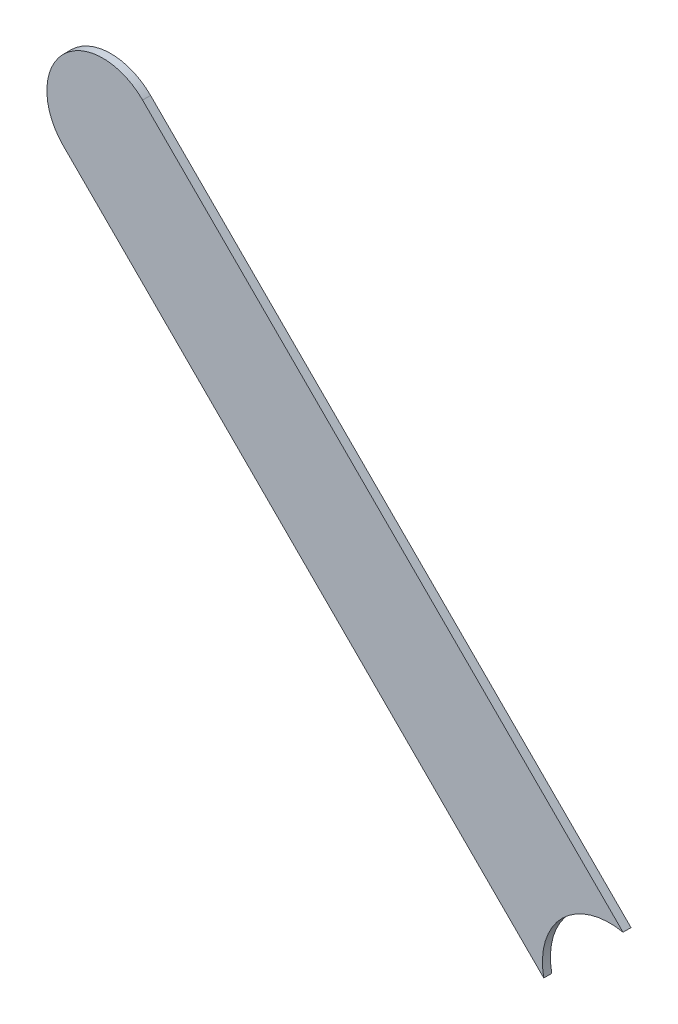
ISO-10303-21;
HEADER;
FILE_DESCRIPTION(('STEP AP214'),'2;1');
FILE_NAME('part.step','',(''),(''),'','','');
FILE_SCHEMA(('AUTOMOTIVE_DESIGN { 1 0 10303 214 1 1 1 1 }'));
ENDSEC;
DATA;
#1=APPLICATION_CONTEXT('core data for automotive mechanical design processes');
#2=APPLICATION_PROTOCOL_DEFINITION('international standard','automotive_design',2000,#1);
#3=PRODUCT_CONTEXT('',#1,'mechanical');
#4=PRODUCT('Part','Part','',(#3));
#5=PRODUCT_RELATED_PRODUCT_CATEGORY('part','',(#4));
#6=PRODUCT_DEFINITION_FORMATION('','',#4);
#7=PRODUCT_DEFINITION_CONTEXT('part definition',#1,'design');
#8=PRODUCT_DEFINITION('design','',#6,#7);
#9=PRODUCT_DEFINITION_SHAPE('','',#8);
#10=(LENGTH_UNIT() NAMED_UNIT(*) SI_UNIT(.MILLI.,.METRE.));
#11=(NAMED_UNIT(*) PLANE_ANGLE_UNIT() SI_UNIT($,.RADIAN.));
#12=(NAMED_UNIT(*) SI_UNIT($,.STERADIAN.) SOLID_ANGLE_UNIT());
#13=UNCERTAINTY_MEASURE_WITH_UNIT(LENGTH_MEASURE(1.E-05),#10,'distance_accuracy_value','');
#14=(GEOMETRIC_REPRESENTATION_CONTEXT(3) GLOBAL_UNCERTAINTY_ASSIGNED_CONTEXT((#13)) GLOBAL_UNIT_ASSIGNED_CONTEXT((#10,
#11,#12)) REPRESENTATION_CONTEXT('',''));
#15=CARTESIAN_POINT('',(0.,0.,0.));
#16=DIRECTION('',(0.,0.,1.));
#17=DIRECTION('',(1.,0.,0.));
#18=AXIS2_PLACEMENT_3D('',#15,#16,#17);
#19=CARTESIAN_POINT('',(116.76324882,115.38321602,0.));
#20=DIRECTION('',(0.70710678118655,0.707106781186545,0.));
#21=DIRECTION('',(0.707106781186545,-0.70710678118655,0.));
#22=AXIS2_PLACEMENT_3D('',#19,#20,#21);
#23=PLANE('',#22);
#24=DIRECTION('',(0.707106781186545,-0.70710678118655,0.));
#25=VECTOR('',#24,1.);
#26=CARTESIAN_POINT('',(116.76324882,115.38321602,0.03556));
#27=LINE('',#26,#25);
#28=CARTESIAN_POINT('',(116.76324882,115.38321602,0.03556));
#29=VERTEX_POINT('',#28);
#30=CARTESIAN_POINT('',(118.905979118199,113.240485721801,0.03556));
#31=VERTEX_POINT('',#30);
#32=EDGE_CURVE('E11',#29,#31,#27,.T.);
#33=ORIENTED_EDGE('',*,*,#32,.F.);
#34=DIRECTION('',(0.,0.,1.));
#35=VECTOR('',#34,1.);
#36=CARTESIAN_POINT('',(116.76324882,115.38321602,0.));
#37=LINE('',#36,#35);
#38=CARTESIAN_POINT('',(116.76324882,115.38321602,0.));
#39=VERTEX_POINT('',#38);
#40=EDGE_CURVE('E24',#39,#29,#37,.T.);
#41=ORIENTED_EDGE('',*,*,#40,.F.);
#42=DIRECTION('',(0.707106781186545,-0.70710678118655,0.));
#43=VECTOR('',#42,1.);
#44=CARTESIAN_POINT('',(116.76324882,115.38321602,0.));
#45=LINE('',#44,#43);
#46=CARTESIAN_POINT('',(118.905979118199,113.240485721801,0.));
#47=VERTEX_POINT('',#46);
#48=EDGE_CURVE('E75',#39,#47,#45,.T.);
#49=ORIENTED_EDGE('',*,*,#48,.T.);
#50=DIRECTION('',(0.,0.,1.));
#51=VECTOR('',#50,1.);
#52=CARTESIAN_POINT('',(118.905979118199,113.240485721801,0.));
#53=LINE('',#52,#51);
#54=EDGE_CURVE('E37',#47,#31,#53,.T.);
#55=ORIENTED_EDGE('',*,*,#54,.T.);
#56=EDGE_LOOP('',(#33,#41,#49,#55));
#57=FACE_BOUND('',#56,.T.);
#58=ADVANCED_FACE('F17',(#57),#23,.F.);
#59=CARTESIAN_POINT('',(119.2000156,113.300002,0.));
#60=DIRECTION('',(0.,0.,-1.));
#61=DIRECTION('',(1.,0.,0.));
#62=AXIS2_PLACEMENT_3D('',#59,#60,#61);
#63=CYLINDRICAL_SURFACE('',#62,0.2999994);
#64=DIRECTION('',(0.,0.,1.));
#65=VECTOR('',#64,1.);
#66=CARTESIAN_POINT('',(119.259531878199,113.594038481801,0.));
#67=LINE('',#66,#65);
#68=CARTESIAN_POINT('',(119.259531878199,113.594038481801,0.));
#69=VERTEX_POINT('',#68);
#70=CARTESIAN_POINT('',(119.259531878199,113.594038481801,0.03556));
#71=VERTEX_POINT('',#70);
#72=EDGE_CURVE('E67',#69,#71,#67,.T.);
#73=ORIENTED_EDGE('',*,*,#72,.T.);
#74=CARTESIAN_POINT('',(119.2000156,113.300002,0.03556));
#75=DIRECTION('',(0.,0.,1.));
#76=DIRECTION('',(1.,0.,0.));
#77=AXIS2_PLACEMENT_3D('',#74,#75,#76);
#78=CIRCLE('',#77,0.2999994);
#79=EDGE_CURVE('E82',#71,#31,#78,.T.);
#80=ORIENTED_EDGE('',*,*,#79,.T.);
#81=ORIENTED_EDGE('',*,*,#54,.F.);
#82=CARTESIAN_POINT('',(119.2000156,113.300002,0.));
#83=DIRECTION('',(0.,0.,1.));
#84=DIRECTION('',(1.,0.,0.));
#85=AXIS2_PLACEMENT_3D('',#82,#83,#84);
#86=CIRCLE('',#85,0.2999994);
#87=EDGE_CURVE('E80',#69,#47,#86,.T.);
#88=ORIENTED_EDGE('',*,*,#87,.F.);
#89=EDGE_LOOP('',(#73,#80,#81,#88));
#90=FACE_BOUND('',#89,.T.);
#91=ADVANCED_FACE('F88',(#90),#63,.F.);
#92=CARTESIAN_POINT('',(119.259531878199,113.594038481801,0.));
#93=DIRECTION('',(-0.707106781186548,-0.707106781186548,0.));
#94=DIRECTION('',(-0.707106781186548,0.707106781186548,0.));
#95=AXIS2_PLACEMENT_3D('',#92,#93,#94);
#96=PLANE('',#95);
#97=DIRECTION('',(-0.707106781186548,0.707106781186548,0.));
#98=VECTOR('',#97,1.);
#99=CARTESIAN_POINT('',(119.37679198,113.47677838,0.03556));
#100=LINE('',#99,#98);
#101=CARTESIAN_POINT('',(117.11680158,115.73676878,0.03556));
#102=VERTEX_POINT('',#101);
#103=EDGE_CURVE('E71',#71,#102,#100,.T.);
#104=ORIENTED_EDGE('',*,*,#103,.F.);
#105=ORIENTED_EDGE('',*,*,#72,.F.);
#106=DIRECTION('',(-0.707106781186548,0.707106781186548,0.));
#107=VECTOR('',#106,1.);
#108=CARTESIAN_POINT('',(119.37679198,113.47677838,0.));
#109=LINE('',#108,#107);
#110=CARTESIAN_POINT('',(117.11680158,115.73676878,0.));
#111=VERTEX_POINT('',#110);
#112=EDGE_CURVE('E63',#69,#111,#109,.T.);
#113=ORIENTED_EDGE('',*,*,#112,.T.);
#114=DIRECTION('',(0.,0.,1.));
#115=VECTOR('',#114,1.);
#116=CARTESIAN_POINT('',(117.11680158,115.73676878,0.));
#117=LINE('',#116,#115);
#118=EDGE_CURVE('E53',#111,#102,#117,.T.);
#119=ORIENTED_EDGE('',*,*,#118,.T.);
#120=EDGE_LOOP('',(#104,#105,#113,#119));
#121=FACE_BOUND('',#120,.T.);
#122=ADVANCED_FACE('F66',(#121),#96,.F.);
#123=CARTESIAN_POINT('',(116.9400252,115.5599924,0.));
#124=DIRECTION('',(0.,0.,-1.));
#125=DIRECTION('',(0.707106781186548,0.707106781186548,0.));
#126=AXIS2_PLACEMENT_3D('',#123,#124,#125);
#127=CYLINDRICAL_SURFACE('',#126,0.249999554103216);
#128=CARTESIAN_POINT('',(116.9400252,115.5599924,0.03556));
#129=DIRECTION('',(0.,0.,1.));
#130=DIRECTION('',(0.707106781186548,0.707106781186548,0.));
#131=AXIS2_PLACEMENT_3D('',#128,#129,#130);
#132=CIRCLE('',#131,0.249999554103216);
#133=EDGE_CURVE('E59',#102,#29,#132,.T.);
#134=ORIENTED_EDGE('',*,*,#133,.F.);
#135=ORIENTED_EDGE('',*,*,#118,.F.);
#136=CARTESIAN_POINT('',(116.9400252,115.5599924,0.));
#137=DIRECTION('',(0.,0.,1.));
#138=DIRECTION('',(0.707106781186548,0.707106781186548,0.));
#139=AXIS2_PLACEMENT_3D('',#136,#137,#138);
#140=CIRCLE('',#139,0.249999554103216);
#141=EDGE_CURVE('E57',#111,#39,#140,.T.);
#142=ORIENTED_EDGE('',*,*,#141,.T.);
#143=ORIENTED_EDGE('',*,*,#40,.T.);
#144=EDGE_LOOP('',(#134,#135,#142,#143));
#145=FACE_BOUND('',#144,.T.);
#146=ADVANCED_FACE('F55',(#145),#127,.T.);
#147=CARTESIAN_POINT('',(116.76324882,115.38321602,0.));
#148=DIRECTION('',(0.,0.,-1.));
#149=DIRECTION('',(-1.,0.,0.));
#150=AXIS2_PLACEMENT_3D('',#147,#148,#149);
#151=PLANE('',#150);
#152=ORIENTED_EDGE('',*,*,#48,.F.);
#153=ORIENTED_EDGE('',*,*,#141,.F.);
#154=ORIENTED_EDGE('',*,*,#112,.F.);
#155=ORIENTED_EDGE('',*,*,#87,.T.);
#156=EDGE_LOOP('',(#152,#153,#154,#155));
#157=FACE_BOUND('',#156,.T.);
#158=ADVANCED_FACE('F74',(#157),#151,.T.);
#159=CARTESIAN_POINT('',(116.76324882,115.38321602,0.03556));
#160=DIRECTION('',(0.,0.,-1.));
#161=DIRECTION('',(-1.,0.,0.));
#162=AXIS2_PLACEMENT_3D('',#159,#160,#161);
#163=PLANE('',#162);
#164=ORIENTED_EDGE('',*,*,#133,.T.);
#165=ORIENTED_EDGE('',*,*,#32,.T.);
#166=ORIENTED_EDGE('',*,*,#79,.F.);
#167=ORIENTED_EDGE('',*,*,#103,.T.);
#168=EDGE_LOOP('',(#164,#165,#166,#167));
#169=FACE_BOUND('',#168,.T.);
#170=ADVANCED_FACE('F91',(#169),#163,.F.);
#171=CLOSED_SHELL('',(#58,#91,#122,#146,#158,#170));
#172=MANIFOLD_SOLID_BREP('B1',#171);
#173=ADVANCED_BREP_SHAPE_REPRESENTATION('',(#18,#172),#14);
#174=SHAPE_DEFINITION_REPRESENTATION(#9,#173);
ENDSEC;
END-ISO-10303-21;
